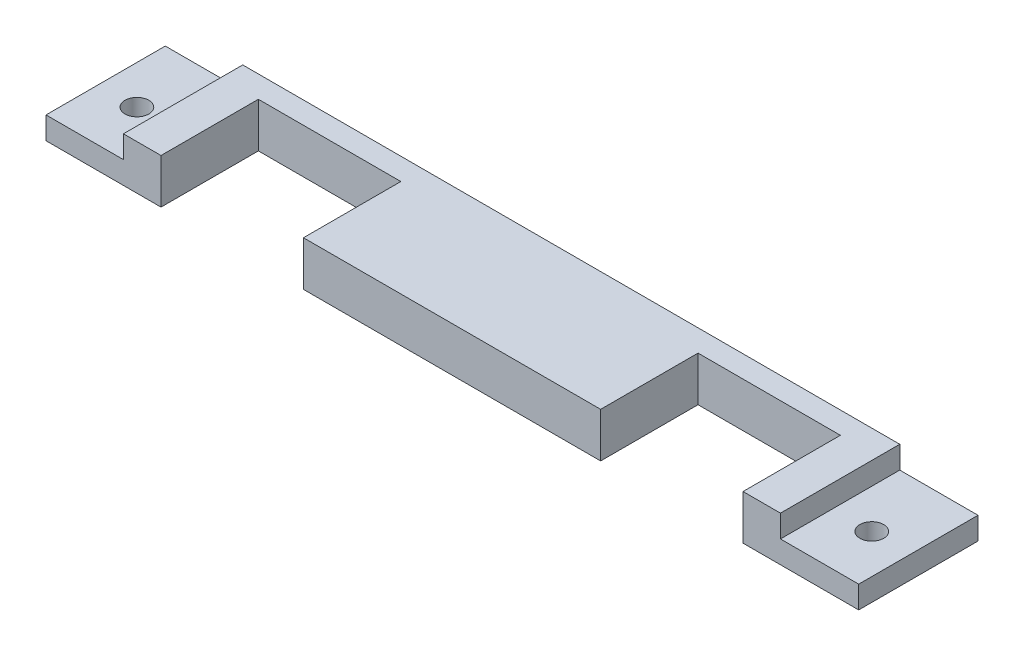
ISO-10303-21;
HEADER;
FILE_DESCRIPTION(('STEP AP214'),'2;1');
FILE_NAME('part.step','',(''),(''),'','','');
FILE_SCHEMA(('AUTOMOTIVE_DESIGN { 1 0 10303 214 1 1 1 1 }'));
ENDSEC;
DATA;
#1=APPLICATION_CONTEXT('core data for automotive mechanical design processes');
#2=APPLICATION_PROTOCOL_DEFINITION('international standard','automotive_design',2000,#1);
#3=PRODUCT_CONTEXT('',#1,'mechanical');
#4=PRODUCT('Part','Part','',(#3));
#5=PRODUCT_RELATED_PRODUCT_CATEGORY('part','',(#4));
#6=PRODUCT_DEFINITION_FORMATION('','',#4);
#7=PRODUCT_DEFINITION_CONTEXT('part definition',#1,'design');
#8=PRODUCT_DEFINITION('design','',#6,#7);
#9=PRODUCT_DEFINITION_SHAPE('','',#8);
#10=(LENGTH_UNIT() NAMED_UNIT(*) SI_UNIT(.MILLI.,.METRE.));
#11=(NAMED_UNIT(*) PLANE_ANGLE_UNIT() SI_UNIT($,.RADIAN.));
#12=(NAMED_UNIT(*) SI_UNIT($,.STERADIAN.) SOLID_ANGLE_UNIT());
#13=UNCERTAINTY_MEASURE_WITH_UNIT(LENGTH_MEASURE(1.E-05),#10,'distance_accuracy_value','');
#14=(GEOMETRIC_REPRESENTATION_CONTEXT(3) GLOBAL_UNCERTAINTY_ASSIGNED_CONTEXT((#13)) GLOBAL_UNIT_ASSIGNED_CONTEXT((#10,
#11,#12)) REPRESENTATION_CONTEXT('',''));
#15=CARTESIAN_POINT('',(0.,0.,0.));
#16=DIRECTION('',(0.,0.,1.));
#17=DIRECTION('',(1.,0.,0.));
#18=AXIS2_PLACEMENT_3D('',#15,#16,#17);
#19=CARTESIAN_POINT('',(0.,3.,0.));
#20=DIRECTION('',(0.,0.,-1.));
#21=DIRECTION('',(-1.,0.,0.));
#22=AXIS2_PLACEMENT_3D('',#19,#20,#21);
#23=PLANE('',#22);
#24=DIRECTION('',(1.,0.,0.));
#25=VECTOR('',#24,1.);
#26=CARTESIAN_POINT('',(10.3849944656627,6.,0.));
#27=LINE('',#26,#25);
#28=CARTESIAN_POINT('',(93.4843476334493,6.,0.));
#29=VERTEX_POINT('',#28);
#30=CARTESIAN_POINT('',(98.5060795947464,6.,0.));
#31=VERTEX_POINT('',#30);
#32=EDGE_CURVE('E257',#29,#31,#27,.T.);
#33=ORIENTED_EDGE('',*,*,#32,.F.);
#34=DIRECTION('',(0.,1.,0.));
#35=VECTOR('',#34,1.);
#36=CARTESIAN_POINT('',(93.4843476334493,0.,0.));
#37=LINE('',#36,#35);
#38=CARTESIAN_POINT('',(93.4843476334493,0.,0.));
#39=VERTEX_POINT('',#38);
#40=EDGE_CURVE('E210',#39,#29,#37,.T.);
#41=ORIENTED_EDGE('',*,*,#40,.F.);
#42=DIRECTION('',(1.,0.,0.));
#43=VECTOR('',#42,1.);
#44=CARTESIAN_POINT('',(0.,0.,0.));
#45=LINE('',#44,#43);
#46=CARTESIAN_POINT('',(109.,0.,0.));
#47=VERTEX_POINT('',#46);
#48=EDGE_CURVE('E276',#39,#47,#45,.T.);
#49=ORIENTED_EDGE('',*,*,#48,.T.);
#50=DIRECTION('',(0.,-1.,0.));
#51=VECTOR('',#50,1.);
#52=CARTESIAN_POINT('',(109.,3.,0.));
#53=LINE('',#52,#51);
#54=CARTESIAN_POINT('',(109.,3.,0.));
#55=VERTEX_POINT('',#54);
#56=EDGE_CURVE('E44',#55,#47,#53,.T.);
#57=ORIENTED_EDGE('',*,*,#56,.F.);
#58=DIRECTION('',(1.,0.,0.));
#59=VECTOR('',#58,1.);
#60=CARTESIAN_POINT('',(0.,3.,0.));
#61=LINE('',#60,#59);
#62=CARTESIAN_POINT('',(98.5060795947464,3.,0.));
#63=VERTEX_POINT('',#62);
#64=EDGE_CURVE('E281',#63,#55,#61,.T.);
#65=ORIENTED_EDGE('',*,*,#64,.F.);
#66=DIRECTION('',(0.,-1.,0.));
#67=VECTOR('',#66,1.);
#68=CARTESIAN_POINT('',(98.5060795947464,6.,0.));
#69=LINE('',#68,#67);
#70=EDGE_CURVE('E158',#31,#63,#69,.T.);
#71=ORIENTED_EDGE('',*,*,#70,.F.);
#72=EDGE_LOOP('',(#33,#41,#49,#57,#65,#71));
#73=FACE_BOUND('',#72,.T.);
#74=ADVANCED_FACE('F35',(#73),#23,.F.);
#75=CARTESIAN_POINT('',(0.,0.,0.));
#76=VERTEX_POINT('',#75);
#77=CARTESIAN_POINT('',(15.423820566113,0.,0.));
#78=VERTEX_POINT('',#77);
#79=EDGE_CURVE('E290',#76,#78,#45,.T.);
#80=ORIENTED_EDGE('',*,*,#79,.T.);
#81=DIRECTION('',(0.,1.,0.));
#82=VECTOR('',#81,1.);
#83=CARTESIAN_POINT('',(15.423820566113,0.,0.));
#84=LINE('',#83,#82);
#85=CARTESIAN_POINT('',(15.423820566113,6.,0.));
#86=VERTEX_POINT('',#85);
#87=EDGE_CURVE('E234',#78,#86,#84,.T.);
#88=ORIENTED_EDGE('',*,*,#87,.T.);
#89=CARTESIAN_POINT('',(10.3849944656627,6.,0.));
#90=VERTEX_POINT('',#89);
#91=EDGE_CURVE('E258',#90,#86,#27,.T.);
#92=ORIENTED_EDGE('',*,*,#91,.F.);
#93=DIRECTION('',(0.,-1.,0.));
#94=VECTOR('',#93,1.);
#95=CARTESIAN_POINT('',(10.3849944656627,6.,0.));
#96=LINE('',#95,#94);
#97=CARTESIAN_POINT('',(10.3849944656627,3.,0.));
#98=VERTEX_POINT('',#97);
#99=EDGE_CURVE('E269',#90,#98,#96,.T.);
#100=ORIENTED_EDGE('',*,*,#99,.T.);
#101=CARTESIAN_POINT('',(0.,3.,0.));
#102=VERTEX_POINT('',#101);
#103=EDGE_CURVE('E284',#102,#98,#61,.T.);
#104=ORIENTED_EDGE('',*,*,#103,.F.);
#105=DIRECTION('',(0.,-1.,0.));
#106=VECTOR('',#105,1.);
#107=CARTESIAN_POINT('',(0.,3.,0.));
#108=LINE('',#107,#106);
#109=EDGE_CURVE('E11',#102,#76,#108,.T.);
#110=ORIENTED_EDGE('',*,*,#109,.T.);
#111=EDGE_LOOP('',(#80,#88,#92,#100,#104,#110));
#112=FACE_BOUND('',#111,.T.);
#113=ADVANCED_FACE('F324',(#112),#23,.F.);
#114=CARTESIAN_POINT('',(0.,3.,0.));
#115=DIRECTION('',(0.,-1.,0.));
#116=DIRECTION('',(0.,0.,-1.));
#117=AXIS2_PLACEMENT_3D('',#114,#115,#116);
#118=PLANE('',#117);
#119=CARTESIAN_POINT('',(103.753039797373,3.,-7.));
#120=DIRECTION('',(0.,1.,0.));
#121=DIRECTION('',(0.,0.,1.));
#122=AXIS2_PLACEMENT_3D('',#119,#120,#121);
#123=CIRCLE('',#122,1.60000000000001);
#124=CARTESIAN_POINT('',(103.753039797373,3.,-5.4));
#125=VERTEX_POINT('',#124);
#126=EDGE_CURVE('E237',#125,#125,#123,.T.);
#127=ORIENTED_EDGE('',*,*,#126,.F.);
#128=EDGE_LOOP('',(#127));
#129=FACE_BOUND('',#128,.T.);
#130=DIRECTION('',(0.,0.,-1.));
#131=VECTOR('',#130,1.);
#132=CARTESIAN_POINT('',(98.5060795947464,3.,0.));
#133=LINE('',#132,#131);
#134=CARTESIAN_POINT('',(98.5060795947464,3.,-16.));
#135=VERTEX_POINT('',#134);
#136=EDGE_CURVE('E151',#63,#135,#133,.T.);
#137=ORIENTED_EDGE('',*,*,#136,.F.);
#138=ORIENTED_EDGE('',*,*,#64,.T.);
#139=DIRECTION('',(0.,0.,-1.));
#140=VECTOR('',#139,1.);
#141=CARTESIAN_POINT('',(109.,3.,0.));
#142=LINE('',#141,#140);
#143=CARTESIAN_POINT('',(109.,3.,-16.));
#144=VERTEX_POINT('',#143);
#145=EDGE_CURVE('E168',#55,#144,#142,.T.);
#146=ORIENTED_EDGE('',*,*,#145,.T.);
#147=DIRECTION('',(1.,0.,0.));
#148=VECTOR('',#147,1.);
#149=CARTESIAN_POINT('',(0.,3.,-16.));
#150=LINE('',#149,#148);
#151=EDGE_CURVE('E165',#135,#144,#150,.T.);
#152=ORIENTED_EDGE('',*,*,#151,.F.);
#153=EDGE_LOOP('',(#137,#138,#146,#152));
#154=FACE_BOUND('',#153,.T.);
#155=ADVANCED_FACE('F166',(#129,#154),#118,.F.);
#156=CARTESIAN_POINT('',(5.19249723283134,3.,-7.));
#157=DIRECTION('',(0.,1.,0.));
#158=DIRECTION('',(0.,0.,1.));
#159=AXIS2_PLACEMENT_3D('',#156,#157,#158);
#160=CIRCLE('',#159,1.6);
#161=CARTESIAN_POINT('',(5.19249723283134,3.,-5.4));
#162=VERTEX_POINT('',#161);
#163=EDGE_CURVE('E246',#162,#162,#160,.T.);
#164=ORIENTED_EDGE('',*,*,#163,.F.);
#165=EDGE_LOOP('',(#164));
#166=FACE_BOUND('',#165,.T.);
#167=DIRECTION('',(0.,0.,1.));
#168=VECTOR('',#167,1.);
#169=CARTESIAN_POINT('',(10.3849944656627,3.,0.));
#170=LINE('',#169,#168);
#171=CARTESIAN_POINT('',(10.3849944656627,3.,-16.));
#172=VERTEX_POINT('',#171);
#173=EDGE_CURVE('E161',#172,#98,#170,.T.);
#174=ORIENTED_EDGE('',*,*,#173,.F.);
#175=DIRECTION('',(1.,0.,0.));
#176=VECTOR('',#175,1.);
#177=CARTESIAN_POINT('',(0.,3.,-16.));
#178=LINE('',#177,#176);
#179=CARTESIAN_POINT('',(0.,3.,-16.));
#180=VERTEX_POINT('',#179);
#181=EDGE_CURVE('E188',#180,#172,#178,.T.);
#182=ORIENTED_EDGE('',*,*,#181,.F.);
#183=DIRECTION('',(0.,0.,1.));
#184=VECTOR('',#183,1.);
#185=CARTESIAN_POINT('',(0.,3.,0.));
#186=LINE('',#185,#184);
#187=EDGE_CURVE('E285',#180,#102,#186,.T.);
#188=ORIENTED_EDGE('',*,*,#187,.T.);
#189=ORIENTED_EDGE('',*,*,#103,.T.);
#190=EDGE_LOOP('',(#174,#182,#188,#189));
#191=FACE_BOUND('',#190,.T.);
#192=ADVANCED_FACE('F313',(#166,#191),#118,.F.);
#193=CARTESIAN_POINT('',(0.,3.,0.));
#194=DIRECTION('',(1.,0.,0.));
#195=DIRECTION('',(0.,0.,-1.));
#196=AXIS2_PLACEMENT_3D('',#193,#194,#195);
#197=PLANE('',#196);
#198=DIRECTION('',(0.,0.,1.));
#199=VECTOR('',#198,1.);
#200=CARTESIAN_POINT('',(0.,0.,0.));
#201=LINE('',#200,#199);
#202=CARTESIAN_POINT('',(0.,0.,-16.));
#203=VERTEX_POINT('',#202);
#204=EDGE_CURVE('E271',#203,#76,#201,.T.);
#205=ORIENTED_EDGE('',*,*,#204,.T.);
#206=ORIENTED_EDGE('',*,*,#109,.F.);
#207=ORIENTED_EDGE('',*,*,#187,.F.);
#208=DIRECTION('',(0.,1.,0.));
#209=VECTOR('',#208,1.);
#210=CARTESIAN_POINT('',(0.,0.,-16.));
#211=LINE('',#210,#209);
#212=EDGE_CURVE('E185',#203,#180,#211,.T.);
#213=ORIENTED_EDGE('',*,*,#212,.F.);
#214=EDGE_LOOP('',(#205,#206,#207,#213));
#215=FACE_BOUND('',#214,.T.);
#216=ADVANCED_FACE('F37',(#215),#197,.F.);
#217=CARTESIAN_POINT('',(34.5321356765851,0.,0.));
#218=VERTEX_POINT('',#217);
#219=CARTESIAN_POINT('',(74.3899843822362,0.,0.));
#220=VERTEX_POINT('',#219);
#221=EDGE_CURVE('E294',#218,#220,#45,.T.);
#222=ORIENTED_EDGE('',*,*,#221,.T.);
#223=DIRECTION('',(0.,1.,0.));
#224=VECTOR('',#223,1.);
#225=CARTESIAN_POINT('',(74.3899843822362,0.,0.));
#226=LINE('',#225,#224);
#227=CARTESIAN_POINT('',(74.3899843822362,6.,0.));
#228=VERTEX_POINT('',#227);
#229=EDGE_CURVE('E213',#220,#228,#226,.T.);
#230=ORIENTED_EDGE('',*,*,#229,.T.);
#231=CARTESIAN_POINT('',(34.5321356765851,6.,0.));
#232=VERTEX_POINT('',#231);
#233=EDGE_CURVE('E261',#232,#228,#27,.T.);
#234=ORIENTED_EDGE('',*,*,#233,.F.);
#235=DIRECTION('',(0.,1.,0.));
#236=VECTOR('',#235,1.);
#237=CARTESIAN_POINT('',(34.5321356765851,0.,0.));
#238=LINE('',#237,#236);
#239=EDGE_CURVE('E60',#218,#232,#238,.T.);
#240=ORIENTED_EDGE('',*,*,#239,.F.);
#241=EDGE_LOOP('',(#222,#230,#234,#240));
#242=FACE_BOUND('',#241,.T.);
#243=ADVANCED_FACE('F325',(#242),#23,.F.);
#244=CARTESIAN_POINT('',(109.,3.,0.));
#245=DIRECTION('',(-1.,0.,0.));
#246=DIRECTION('',(0.,0.,1.));
#247=AXIS2_PLACEMENT_3D('',#244,#245,#246);
#248=PLANE('',#247);
#249=DIRECTION('',(0.,0.,-1.));
#250=VECTOR('',#249,1.);
#251=CARTESIAN_POINT('',(109.,0.,0.));
#252=LINE('',#251,#250);
#253=CARTESIAN_POINT('',(109.,0.,-16.));
#254=VERTEX_POINT('',#253);
#255=EDGE_CURVE('E293',#47,#254,#252,.T.);
#256=ORIENTED_EDGE('',*,*,#255,.T.);
#257=DIRECTION('',(0.,-1.,0.));
#258=VECTOR('',#257,1.);
#259=CARTESIAN_POINT('',(109.,0.,-16.));
#260=LINE('',#259,#258);
#261=EDGE_CURVE('E172',#144,#254,#260,.T.);
#262=ORIENTED_EDGE('',*,*,#261,.F.);
#263=ORIENTED_EDGE('',*,*,#145,.F.);
#264=ORIENTED_EDGE('',*,*,#56,.T.);
#265=EDGE_LOOP('',(#256,#262,#263,#264));
#266=FACE_BOUND('',#265,.T.);
#267=ADVANCED_FACE('F300',(#266),#248,.F.);
#268=CARTESIAN_POINT('',(0.,0.,0.));
#269=DIRECTION('',(0.,-1.,0.));
#270=DIRECTION('',(0.,0.,-1.));
#271=AXIS2_PLACEMENT_3D('',#268,#269,#270);
#272=PLANE('',#271);
#273=DIRECTION('',(0.,0.,-1.));
#274=VECTOR('',#273,1.);
#275=CARTESIAN_POINT('',(93.4843476334493,0.,-13.0609007443283));
#276=LINE('',#275,#274);
#277=CARTESIAN_POINT('',(93.4843476334493,0.,-13.0609007443283));
#278=VERTEX_POINT('',#277);
#279=EDGE_CURVE('E194',#39,#278,#276,.T.);
#280=ORIENTED_EDGE('',*,*,#279,.T.);
#281=DIRECTION('',(-1.,0.,0.));
#282=VECTOR('',#281,1.);
#283=CARTESIAN_POINT('',(74.3899843822362,0.,-13.0609007443283));
#284=LINE('',#283,#282);
#285=CARTESIAN_POINT('',(74.3899843822362,0.,-13.0609007443283));
#286=VERTEX_POINT('',#285);
#287=EDGE_CURVE('E197',#278,#286,#284,.T.);
#288=ORIENTED_EDGE('',*,*,#287,.T.);
#289=DIRECTION('',(0.,0.,1.));
#290=VECTOR('',#289,1.);
#291=CARTESIAN_POINT('',(74.3899843822362,0.,-13.0609007443283));
#292=LINE('',#291,#290);
#293=EDGE_CURVE('E201',#286,#220,#292,.T.);
#294=ORIENTED_EDGE('',*,*,#293,.T.);
#295=ORIENTED_EDGE('',*,*,#221,.F.);
#296=DIRECTION('',(0.,0.,-1.));
#297=VECTOR('',#296,1.);
#298=CARTESIAN_POINT('',(34.5321356765851,0.,-13.0609007443283));
#299=LINE('',#298,#297);
#300=CARTESIAN_POINT('',(34.5321356765851,0.,-13.0609007443283));
#301=VERTEX_POINT('',#300);
#302=EDGE_CURVE('E219',#218,#301,#299,.T.);
#303=ORIENTED_EDGE('',*,*,#302,.T.);
#304=DIRECTION('',(-1.,0.,0.));
#305=VECTOR('',#304,1.);
#306=CARTESIAN_POINT('',(15.423820566113,0.,-13.0609007443283));
#307=LINE('',#306,#305);
#308=CARTESIAN_POINT('',(15.423820566113,0.,-13.0609007443283));
#309=VERTEX_POINT('',#308);
#310=EDGE_CURVE('E222',#301,#309,#307,.T.);
#311=ORIENTED_EDGE('',*,*,#310,.T.);
#312=DIRECTION('',(0.,0.,1.));
#313=VECTOR('',#312,1.);
#314=CARTESIAN_POINT('',(15.423820566113,0.,-13.0609007443283));
#315=LINE('',#314,#313);
#316=EDGE_CURVE('E226',#309,#78,#315,.T.);
#317=ORIENTED_EDGE('',*,*,#316,.T.);
#318=ORIENTED_EDGE('',*,*,#79,.F.);
#319=ORIENTED_EDGE('',*,*,#204,.F.);
#320=DIRECTION('',(-1.,0.,0.));
#321=VECTOR('',#320,1.);
#322=CARTESIAN_POINT('',(0.,0.,-16.));
#323=LINE('',#322,#321);
#324=EDGE_CURVE('E182',#254,#203,#323,.T.);
#325=ORIENTED_EDGE('',*,*,#324,.F.);
#326=ORIENTED_EDGE('',*,*,#255,.F.);
#327=ORIENTED_EDGE('',*,*,#48,.F.);
#328=EDGE_LOOP('',(#280,#288,#294,#295,#303,#311,#317,#318,#319,#325,#326,#327));
#329=FACE_BOUND('',#328,.T.);
#330=CARTESIAN_POINT('',(103.753039797373,0.,-7.));
#331=DIRECTION('',(0.,1.,0.));
#332=DIRECTION('',(0.,0.,1.));
#333=AXIS2_PLACEMENT_3D('',#330,#331,#332);
#334=CIRCLE('',#333,1.60000000000001);
#335=CARTESIAN_POINT('',(103.753039797373,0.,-5.4));
#336=VERTEX_POINT('',#335);
#337=EDGE_CURVE('E243',#336,#336,#334,.T.);
#338=ORIENTED_EDGE('',*,*,#337,.T.);
#339=EDGE_LOOP('',(#338));
#340=FACE_BOUND('',#339,.T.);
#341=CARTESIAN_POINT('',(5.19249723283134,0.,-7.));
#342=DIRECTION('',(0.,1.,0.));
#343=DIRECTION('',(0.,0.,1.));
#344=AXIS2_PLACEMENT_3D('',#341,#342,#343);
#345=CIRCLE('',#344,1.6);
#346=CARTESIAN_POINT('',(5.19249723283134,0.,-5.4));
#347=VERTEX_POINT('',#346);
#348=EDGE_CURVE('E162',#347,#347,#345,.T.);
#349=ORIENTED_EDGE('',*,*,#348,.T.);
#350=EDGE_LOOP('',(#349));
#351=FACE_BOUND('',#350,.T.);
#352=ADVANCED_FACE('F305',(#329,#340,#351),#272,.T.);
#353=CARTESIAN_POINT('',(98.5060795947464,6.,0.));
#354=DIRECTION('',(-1.,0.,0.));
#355=DIRECTION('',(0.,0.,1.));
#356=AXIS2_PLACEMENT_3D('',#353,#354,#355);
#357=PLANE('',#356);
#358=ORIENTED_EDGE('',*,*,#136,.T.);
#359=DIRECTION('',(0.,1.,0.));
#360=VECTOR('',#359,1.);
#361=CARTESIAN_POINT('',(98.5060795947464,0.,-16.));
#362=LINE('',#361,#360);
#363=CARTESIAN_POINT('',(98.5060795947464,6.,-16.));
#364=VERTEX_POINT('',#363);
#365=EDGE_CURVE('E156',#135,#364,#362,.T.);
#366=ORIENTED_EDGE('',*,*,#365,.T.);
#367=DIRECTION('',(0.,0.,-1.));
#368=VECTOR('',#367,1.);
#369=CARTESIAN_POINT('',(98.5060795947464,6.,0.));
#370=LINE('',#369,#368);
#371=EDGE_CURVE('E253',#31,#364,#370,.T.);
#372=ORIENTED_EDGE('',*,*,#371,.F.);
#373=ORIENTED_EDGE('',*,*,#70,.T.);
#374=EDGE_LOOP('',(#358,#366,#372,#373));
#375=FACE_BOUND('',#374,.T.);
#376=ADVANCED_FACE('F153',(#375),#357,.F.);
#377=CARTESIAN_POINT('',(10.3849944656627,6.,0.));
#378=DIRECTION('',(1.,0.,0.));
#379=DIRECTION('',(0.,0.,-1.));
#380=AXIS2_PLACEMENT_3D('',#377,#378,#379);
#381=PLANE('',#380);
#382=ORIENTED_EDGE('',*,*,#173,.T.);
#383=ORIENTED_EDGE('',*,*,#99,.F.);
#384=DIRECTION('',(0.,0.,1.));
#385=VECTOR('',#384,1.);
#386=CARTESIAN_POINT('',(10.3849944656627,6.,0.));
#387=LINE('',#386,#385);
#388=CARTESIAN_POINT('',(10.3849944656627,6.,-16.));
#389=VERTEX_POINT('',#388);
#390=EDGE_CURVE('E255',#389,#90,#387,.T.);
#391=ORIENTED_EDGE('',*,*,#390,.F.);
#392=DIRECTION('',(0.,1.,0.));
#393=VECTOR('',#392,1.);
#394=CARTESIAN_POINT('',(10.3849944656627,0.,-16.));
#395=LINE('',#394,#393);
#396=EDGE_CURVE('E191',#172,#389,#395,.T.);
#397=ORIENTED_EDGE('',*,*,#396,.F.);
#398=EDGE_LOOP('',(#382,#383,#391,#397));
#399=FACE_BOUND('',#398,.T.);
#400=ADVANCED_FACE('F316',(#399),#381,.F.);
#401=CARTESIAN_POINT('',(0.,6.,0.));
#402=DIRECTION('',(0.,-1.,0.));
#403=DIRECTION('',(0.,0.,-1.));
#404=AXIS2_PLACEMENT_3D('',#401,#402,#403);
#405=PLANE('',#404);
#406=DIRECTION('',(-1.,0.,0.));
#407=VECTOR('',#406,1.);
#408=CARTESIAN_POINT('',(74.3899843822362,6.,-13.0609007443283));
#409=LINE('',#408,#407);
#410=CARTESIAN_POINT('',(93.4843476334493,6.,-13.0609007443283));
#411=VERTEX_POINT('',#410);
#412=CARTESIAN_POINT('',(74.3899843822362,6.,-13.0609007443283));
#413=VERTEX_POINT('',#412);
#414=EDGE_CURVE('E206',#411,#413,#409,.T.);
#415=ORIENTED_EDGE('',*,*,#414,.F.);
#416=DIRECTION('',(0.,0.,-1.));
#417=VECTOR('',#416,1.);
#418=CARTESIAN_POINT('',(93.4843476334493,6.,-13.0609007443283));
#419=LINE('',#418,#417);
#420=EDGE_CURVE('E52',#29,#411,#419,.T.);
#421=ORIENTED_EDGE('',*,*,#420,.F.);
#422=ORIENTED_EDGE('',*,*,#32,.T.);
#423=ORIENTED_EDGE('',*,*,#371,.T.);
#424=DIRECTION('',(1.,0.,0.));
#425=VECTOR('',#424,1.);
#426=CARTESIAN_POINT('',(0.,6.,-16.));
#427=LINE('',#426,#425);
#428=EDGE_CURVE('E178',#389,#364,#427,.T.);
#429=ORIENTED_EDGE('',*,*,#428,.F.);
#430=ORIENTED_EDGE('',*,*,#390,.T.);
#431=ORIENTED_EDGE('',*,*,#91,.T.);
#432=DIRECTION('',(0.,0.,1.));
#433=VECTOR('',#432,1.);
#434=CARTESIAN_POINT('',(15.423820566113,6.,-13.0609007443283));
#435=LINE('',#434,#433);
#436=CARTESIAN_POINT('',(15.423820566113,6.,-13.0609007443283));
#437=VERTEX_POINT('',#436);
#438=EDGE_CURVE('E223',#437,#86,#435,.T.);
#439=ORIENTED_EDGE('',*,*,#438,.F.);
#440=DIRECTION('',(-1.,0.,0.));
#441=VECTOR('',#440,1.);
#442=CARTESIAN_POINT('',(15.423820566113,6.,-13.0609007443283));
#443=LINE('',#442,#441);
#444=CARTESIAN_POINT('',(34.5321356765851,6.,-13.0609007443283));
#445=VERTEX_POINT('',#444);
#446=EDGE_CURVE('E230',#445,#437,#443,.T.);
#447=ORIENTED_EDGE('',*,*,#446,.F.);
#448=DIRECTION('',(0.,0.,-1.));
#449=VECTOR('',#448,1.);
#450=CARTESIAN_POINT('',(34.5321356765851,6.,-13.0609007443283));
#451=LINE('',#450,#449);
#452=EDGE_CURVE('E212',#232,#445,#451,.T.);
#453=ORIENTED_EDGE('',*,*,#452,.F.);
#454=ORIENTED_EDGE('',*,*,#233,.T.);
#455=DIRECTION('',(0.,0.,1.));
#456=VECTOR('',#455,1.);
#457=CARTESIAN_POINT('',(74.3899843822362,6.,-13.0609007443283));
#458=LINE('',#457,#456);
#459=EDGE_CURVE('E198',#413,#228,#458,.T.);
#460=ORIENTED_EDGE('',*,*,#459,.F.);
#461=EDGE_LOOP('',(#415,#421,#422,#423,#429,#430,#431,#439,#447,#453,#454,#460));
#462=FACE_BOUND('',#461,.T.);
#463=ADVANCED_FACE('F319',(#462),#405,.F.);
#464=CARTESIAN_POINT('',(5.19249723283134,0.,-7.));
#465=DIRECTION('',(0.,1.,0.));
#466=DIRECTION('',(0.,0.,1.));
#467=AXIS2_PLACEMENT_3D('',#464,#465,#466);
#468=CYLINDRICAL_SURFACE('',#467,1.6);
#469=ORIENTED_EDGE('',*,*,#348,.F.);
#470=EDGE_LOOP('',(#469));
#471=FACE_BOUND('',#470,.T.);
#472=ORIENTED_EDGE('',*,*,#163,.T.);
#473=EDGE_LOOP('',(#472));
#474=FACE_BOUND('',#473,.T.);
#475=ADVANCED_FACE('F364',(#471,#474),#468,.F.);
#476=CARTESIAN_POINT('',(103.753039797373,0.,-7.));
#477=DIRECTION('',(0.,1.,0.));
#478=DIRECTION('',(0.,0.,1.));
#479=AXIS2_PLACEMENT_3D('',#476,#477,#478);
#480=CYLINDRICAL_SURFACE('',#479,1.60000000000001);
#481=ORIENTED_EDGE('',*,*,#337,.F.);
#482=EDGE_LOOP('',(#481));
#483=FACE_BOUND('',#482,.T.);
#484=ORIENTED_EDGE('',*,*,#126,.T.);
#485=EDGE_LOOP('',(#484));
#486=FACE_BOUND('',#485,.T.);
#487=ADVANCED_FACE('F357',(#483,#486),#480,.F.);
#488=CARTESIAN_POINT('',(15.423820566113,0.,-13.0609007443283));
#489=DIRECTION('',(-1.,0.,0.));
#490=DIRECTION('',(0.,0.,1.));
#491=AXIS2_PLACEMENT_3D('',#488,#489,#490);
#492=PLANE('',#491);
#493=ORIENTED_EDGE('',*,*,#438,.T.);
#494=ORIENTED_EDGE('',*,*,#87,.F.);
#495=ORIENTED_EDGE('',*,*,#316,.F.);
#496=DIRECTION('',(0.,1.,0.));
#497=VECTOR('',#496,1.);
#498=CARTESIAN_POINT('',(15.423820566113,0.,-13.0609007443283));
#499=LINE('',#498,#497);
#500=EDGE_CURVE('E238',#309,#437,#499,.T.);
#501=ORIENTED_EDGE('',*,*,#500,.T.);
#502=EDGE_LOOP('',(#493,#494,#495,#501));
#503=FACE_BOUND('',#502,.T.);
#504=ADVANCED_FACE('F355',(#503),#492,.F.);
#505=CARTESIAN_POINT('',(15.423820566113,0.,-13.0609007443283));
#506=DIRECTION('',(0.,0.,-1.));
#507=DIRECTION('',(-1.,0.,0.));
#508=AXIS2_PLACEMENT_3D('',#505,#506,#507);
#509=PLANE('',#508);
#510=ORIENTED_EDGE('',*,*,#446,.T.);
#511=ORIENTED_EDGE('',*,*,#500,.F.);
#512=ORIENTED_EDGE('',*,*,#310,.F.);
#513=DIRECTION('',(0.,1.,0.));
#514=VECTOR('',#513,1.);
#515=CARTESIAN_POINT('',(34.5321356765851,0.,-13.0609007443283));
#516=LINE('',#515,#514);
#517=EDGE_CURVE('E240',#301,#445,#516,.T.);
#518=ORIENTED_EDGE('',*,*,#517,.T.);
#519=EDGE_LOOP('',(#510,#511,#512,#518));
#520=FACE_BOUND('',#519,.T.);
#521=ADVANCED_FACE('F352',(#520),#509,.F.);
#522=CARTESIAN_POINT('',(34.5321356765851,0.,-13.0609007443283));
#523=DIRECTION('',(1.,0.,0.));
#524=DIRECTION('',(0.,0.,-1.));
#525=AXIS2_PLACEMENT_3D('',#522,#523,#524);
#526=PLANE('',#525);
#527=ORIENTED_EDGE('',*,*,#452,.T.);
#528=ORIENTED_EDGE('',*,*,#517,.F.);
#529=ORIENTED_EDGE('',*,*,#302,.F.);
#530=ORIENTED_EDGE('',*,*,#239,.T.);
#531=EDGE_LOOP('',(#527,#528,#529,#530));
#532=FACE_BOUND('',#531,.T.);
#533=ADVANCED_FACE('F349',(#532),#526,.F.);
#534=CARTESIAN_POINT('',(93.4843476334493,0.,-13.0609007443283));
#535=DIRECTION('',(1.,0.,0.));
#536=DIRECTION('',(0.,0.,-1.));
#537=AXIS2_PLACEMENT_3D('',#534,#535,#536);
#538=PLANE('',#537);
#539=ORIENTED_EDGE('',*,*,#420,.T.);
#540=DIRECTION('',(0.,1.,0.));
#541=VECTOR('',#540,1.);
#542=CARTESIAN_POINT('',(93.4843476334493,0.,-13.0609007443283));
#543=LINE('',#542,#541);
#544=EDGE_CURVE('E204',#278,#411,#543,.T.);
#545=ORIENTED_EDGE('',*,*,#544,.F.);
#546=ORIENTED_EDGE('',*,*,#279,.F.);
#547=ORIENTED_EDGE('',*,*,#40,.T.);
#548=EDGE_LOOP('',(#539,#545,#546,#547));
#549=FACE_BOUND('',#548,.T.);
#550=ADVANCED_FACE('F340',(#549),#538,.F.);
#551=CARTESIAN_POINT('',(74.3899843822362,0.,-13.0609007443283));
#552=DIRECTION('',(-1.,0.,0.));
#553=DIRECTION('',(0.,0.,1.));
#554=AXIS2_PLACEMENT_3D('',#551,#552,#553);
#555=PLANE('',#554);
#556=ORIENTED_EDGE('',*,*,#459,.T.);
#557=ORIENTED_EDGE('',*,*,#229,.F.);
#558=ORIENTED_EDGE('',*,*,#293,.F.);
#559=DIRECTION('',(0.,1.,0.));
#560=VECTOR('',#559,1.);
#561=CARTESIAN_POINT('',(74.3899843822362,0.,-13.0609007443283));
#562=LINE('',#561,#560);
#563=EDGE_CURVE('E216',#286,#413,#562,.T.);
#564=ORIENTED_EDGE('',*,*,#563,.T.);
#565=EDGE_LOOP('',(#556,#557,#558,#564));
#566=FACE_BOUND('',#565,.T.);
#567=ADVANCED_FACE('F347',(#566),#555,.F.);
#568=CARTESIAN_POINT('',(74.3899843822362,0.,-13.0609007443283));
#569=DIRECTION('',(0.,0.,-1.));
#570=DIRECTION('',(-1.,0.,0.));
#571=AXIS2_PLACEMENT_3D('',#568,#569,#570);
#572=PLANE('',#571);
#573=ORIENTED_EDGE('',*,*,#414,.T.);
#574=ORIENTED_EDGE('',*,*,#563,.F.);
#575=ORIENTED_EDGE('',*,*,#287,.F.);
#576=ORIENTED_EDGE('',*,*,#544,.T.);
#577=EDGE_LOOP('',(#573,#574,#575,#576));
#578=FACE_BOUND('',#577,.T.);
#579=ADVANCED_FACE('F344',(#578),#572,.F.);
#580=CARTESIAN_POINT('',(0.,0.,-16.));
#581=DIRECTION('',(0.,0.,-1.));
#582=DIRECTION('',(-1.,0.,0.));
#583=AXIS2_PLACEMENT_3D('',#580,#581,#582);
#584=PLANE('',#583);
#585=ORIENTED_EDGE('',*,*,#365,.F.);
#586=ORIENTED_EDGE('',*,*,#151,.T.);
#587=ORIENTED_EDGE('',*,*,#261,.T.);
#588=ORIENTED_EDGE('',*,*,#324,.T.);
#589=ORIENTED_EDGE('',*,*,#212,.T.);
#590=ORIENTED_EDGE('',*,*,#181,.T.);
#591=ORIENTED_EDGE('',*,*,#396,.T.);
#592=ORIENTED_EDGE('',*,*,#428,.T.);
#593=EDGE_LOOP('',(#585,#586,#587,#588,#589,#590,#591,#592));
#594=FACE_BOUND('',#593,.T.);
#595=ADVANCED_FACE('F175',(#594),#584,.T.);
#596=CLOSED_SHELL('',(#74,#113,#155,#192,#216,#243,#267,#352,#376,#400,#463,#475,#487,#504,#521,
#533,#550,#567,#579,#595));
#597=MANIFOLD_SOLID_BREP('B2',#596);
#598=ADVANCED_BREP_SHAPE_REPRESENTATION('',(#18,#597),#14);
#599=SHAPE_DEFINITION_REPRESENTATION(#9,#598);
ENDSEC;
END-ISO-10303-21;
